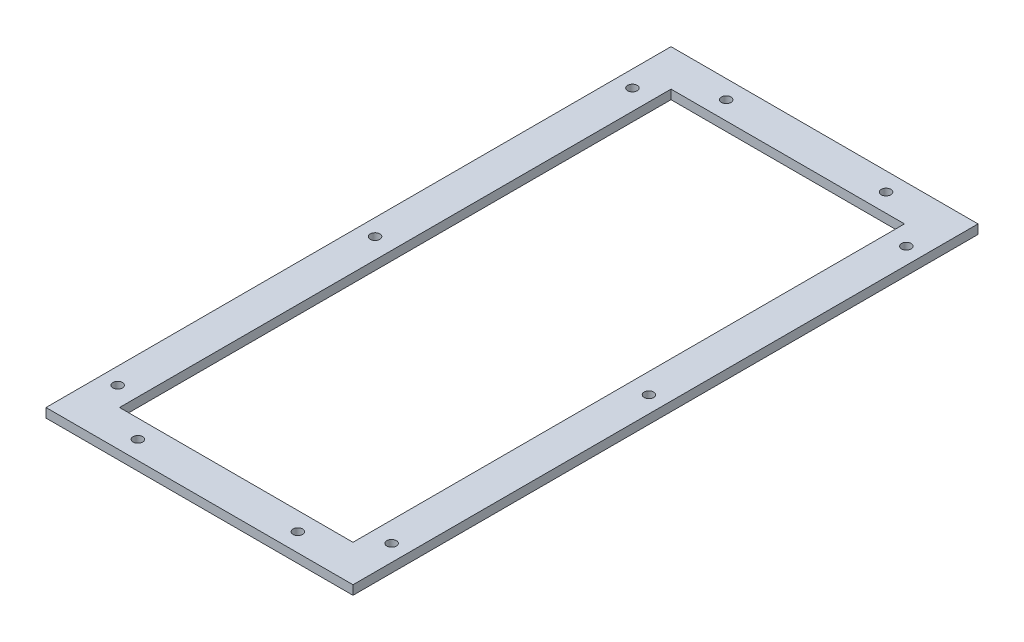
ISO-10303-21;
HEADER;
FILE_DESCRIPTION(('STEP AP214'),'2;1');
FILE_NAME('part.step','',(''),(''),'','','');
FILE_SCHEMA(('AUTOMOTIVE_DESIGN { 1 0 10303 214 1 1 1 1 }'));
ENDSEC;
DATA;
#1=APPLICATION_CONTEXT('core data for automotive mechanical design processes');
#2=APPLICATION_PROTOCOL_DEFINITION('international standard','automotive_design',2000,#1);
#3=PRODUCT_CONTEXT('',#1,'mechanical');
#4=PRODUCT('Part','Part','',(#3));
#5=PRODUCT_RELATED_PRODUCT_CATEGORY('part','',(#4));
#6=PRODUCT_DEFINITION_FORMATION('','',#4);
#7=PRODUCT_DEFINITION_CONTEXT('part definition',#1,'design');
#8=PRODUCT_DEFINITION('design','',#6,#7);
#9=PRODUCT_DEFINITION_SHAPE('','',#8);
#10=(LENGTH_UNIT() NAMED_UNIT(*) SI_UNIT(.MILLI.,.METRE.));
#11=(NAMED_UNIT(*) PLANE_ANGLE_UNIT() SI_UNIT($,.RADIAN.));
#12=(NAMED_UNIT(*) SI_UNIT($,.STERADIAN.) SOLID_ANGLE_UNIT());
#13=UNCERTAINTY_MEASURE_WITH_UNIT(LENGTH_MEASURE(1.E-05),#10,'distance_accuracy_value','');
#14=(GEOMETRIC_REPRESENTATION_CONTEXT(3) GLOBAL_UNCERTAINTY_ASSIGNED_CONTEXT((#13)) GLOBAL_UNIT_ASSIGNED_CONTEXT((#10,
#11,#12)) REPRESENTATION_CONTEXT('',''));
#15=CARTESIAN_POINT('',(0.,0.,0.));
#16=DIRECTION('',(0.,0.,1.));
#17=DIRECTION('',(1.,0.,0.));
#18=AXIS2_PLACEMENT_3D('',#15,#16,#17);
#19=CARTESIAN_POINT('',(0.,5.,0.));
#20=DIRECTION('',(0.,1.,0.));
#21=DIRECTION('',(0.,0.,1.));
#22=AXIS2_PLACEMENT_3D('',#19,#20,#21);
#23=PLANE('',#22);
#24=DIRECTION('',(-1.,0.,0.));
#25=VECTOR('',#24,1.);
#26=CARTESIAN_POINT('',(63.5,5.,-150.));
#27=LINE('',#26,#25);
#28=CARTESIAN_POINT('',(63.5,5.,-150.));
#29=VERTEX_POINT('',#28);
#30=CARTESIAN_POINT('',(-63.5,5.,-150.));
#31=VERTEX_POINT('',#30);
#32=EDGE_CURVE('E52',#29,#31,#27,.T.);
#33=ORIENTED_EDGE('',*,*,#32,.F.);
#34=DIRECTION('',(0.,0.,-1.));
#35=VECTOR('',#34,1.);
#36=CARTESIAN_POINT('',(63.5,5.,150.));
#37=LINE('',#36,#35);
#38=CARTESIAN_POINT('',(63.5,5.,150.));
#39=VERTEX_POINT('',#38);
#40=EDGE_CURVE('E120',#39,#29,#37,.T.);
#41=ORIENTED_EDGE('',*,*,#40,.F.);
#42=DIRECTION('',(1.,0.,0.));
#43=VECTOR('',#42,1.);
#44=CARTESIAN_POINT('',(-63.5,5.,150.));
#45=LINE('',#44,#43);
#46=CARTESIAN_POINT('',(-63.5,5.,150.));
#47=VERTEX_POINT('',#46);
#48=EDGE_CURVE('E105',#47,#39,#45,.T.);
#49=ORIENTED_EDGE('',*,*,#48,.F.);
#50=DIRECTION('',(0.,0.,1.));
#51=VECTOR('',#50,1.);
#52=CARTESIAN_POINT('',(-63.5,5.,-150.));
#53=LINE('',#52,#51);
#54=EDGE_CURVE('E114',#31,#47,#53,.T.);
#55=ORIENTED_EDGE('',*,*,#54,.F.);
#56=EDGE_LOOP('',(#33,#41,#49,#55));
#57=FACE_BOUND('',#56,.T.);
#58=CARTESIAN_POINT('',(-43.5,5.,160.));
#59=DIRECTION('',(0.,1.,0.));
#60=DIRECTION('',(0.,0.,1.));
#61=AXIS2_PLACEMENT_3D('',#58,#59,#60);
#62=CIRCLE('',#61,2.59999999999998);
#63=CARTESIAN_POINT('',(-43.5,5.,162.6));
#64=VERTEX_POINT('',#63);
#65=EDGE_CURVE('E136',#64,#64,#62,.T.);
#66=ORIENTED_EDGE('',*,*,#65,.F.);
#67=EDGE_LOOP('',(#66));
#68=FACE_BOUND('',#67,.T.);
#69=CARTESIAN_POINT('',(-43.5,5.,-160.));
#70=DIRECTION('',(0.,1.,0.));
#71=DIRECTION('',(0.,0.,1.));
#72=AXIS2_PLACEMENT_3D('',#69,#70,#71);
#73=CIRCLE('',#72,2.59999999999997);
#74=CARTESIAN_POINT('',(-43.5,5.,-157.4));
#75=VERTEX_POINT('',#74);
#76=EDGE_CURVE('E148',#75,#75,#73,.T.);
#77=ORIENTED_EDGE('',*,*,#76,.F.);
#78=EDGE_LOOP('',(#77));
#79=FACE_BOUND('',#78,.T.);
#80=CARTESIAN_POINT('',(74.5000000000001,5.,0.));
#81=DIRECTION('',(0.,1.,0.));
#82=DIRECTION('',(0.,0.,1.));
#83=AXIS2_PLACEMENT_3D('',#80,#81,#82);
#84=CIRCLE('',#83,2.6);
#85=CARTESIAN_POINT('',(74.5000000000001,5.,2.6));
#86=VERTEX_POINT('',#85);
#87=EDGE_CURVE('E160',#86,#86,#84,.T.);
#88=ORIENTED_EDGE('',*,*,#87,.F.);
#89=EDGE_LOOP('',(#88));
#90=FACE_BOUND('',#89,.T.);
#91=CARTESIAN_POINT('',(-74.5,5.,140.));
#92=DIRECTION('',(0.,1.,0.));
#93=DIRECTION('',(0.,0.,1.));
#94=AXIS2_PLACEMENT_3D('',#91,#92,#93);
#95=CIRCLE('',#94,2.6);
#96=CARTESIAN_POINT('',(-74.5,5.,142.6));
#97=VERTEX_POINT('',#96);
#98=EDGE_CURVE('E172',#97,#97,#95,.T.);
#99=ORIENTED_EDGE('',*,*,#98,.F.);
#100=EDGE_LOOP('',(#99));
#101=FACE_BOUND('',#100,.T.);
#102=CARTESIAN_POINT('',(-74.5000000000001,5.,-140.));
#103=DIRECTION('',(0.,1.,0.));
#104=DIRECTION('',(0.,0.,1.));
#105=AXIS2_PLACEMENT_3D('',#102,#103,#104);
#106=CIRCLE('',#105,2.6);
#107=CARTESIAN_POINT('',(-74.5000000000001,5.,-137.4));
#108=VERTEX_POINT('',#107);
#109=EDGE_CURVE('E184',#108,#108,#106,.T.);
#110=ORIENTED_EDGE('',*,*,#109,.F.);
#111=EDGE_LOOP('',(#110));
#112=FACE_BOUND('',#111,.T.);
#113=DIRECTION('',(0.,0.,1.));
#114=VECTOR('',#113,1.);
#115=CARTESIAN_POINT('',(-83.5,5.,-170.));
#116=LINE('',#115,#114);
#117=CARTESIAN_POINT('',(-83.5,5.,-170.));
#118=VERTEX_POINT('',#117);
#119=CARTESIAN_POINT('',(-83.5,5.,170.));
#120=VERTEX_POINT('',#119);
#121=EDGE_CURVE('E190',#118,#120,#116,.T.);
#122=ORIENTED_EDGE('',*,*,#121,.T.);
#123=DIRECTION('',(1.,0.,0.));
#124=VECTOR('',#123,1.);
#125=CARTESIAN_POINT('',(-83.5,5.,170.));
#126=LINE('',#125,#124);
#127=CARTESIAN_POINT('',(83.5,5.,170.));
#128=VERTEX_POINT('',#127);
#129=EDGE_CURVE('E193',#120,#128,#126,.T.);
#130=ORIENTED_EDGE('',*,*,#129,.T.);
#131=DIRECTION('',(0.,0.,-1.));
#132=VECTOR('',#131,1.);
#133=CARTESIAN_POINT('',(83.5,5.,-170.));
#134=LINE('',#133,#132);
#135=CARTESIAN_POINT('',(83.5,5.,-170.));
#136=VERTEX_POINT('',#135);
#137=EDGE_CURVE('E196',#128,#136,#134,.T.);
#138=ORIENTED_EDGE('',*,*,#137,.T.);
#139=DIRECTION('',(-1.,0.,0.));
#140=VECTOR('',#139,1.);
#141=CARTESIAN_POINT('',(-83.5,5.,-170.));
#142=LINE('',#141,#140);
#143=EDGE_CURVE('E198',#136,#118,#142,.T.);
#144=ORIENTED_EDGE('',*,*,#143,.T.);
#145=EDGE_LOOP('',(#122,#130,#138,#144));
#146=FACE_BOUND('',#145,.T.);
#147=CARTESIAN_POINT('',(-74.5,5.,0.));
#148=DIRECTION('',(0.,1.,0.));
#149=DIRECTION('',(0.,0.,1.));
#150=AXIS2_PLACEMENT_3D('',#147,#148,#149);
#151=CIRCLE('',#150,2.6);
#152=CARTESIAN_POINT('',(-74.5,5.,2.6));
#153=VERTEX_POINT('',#152);
#154=EDGE_CURVE('E178',#153,#153,#151,.T.);
#155=ORIENTED_EDGE('',*,*,#154,.F.);
#156=EDGE_LOOP('',(#155));
#157=FACE_BOUND('',#156,.T.);
#158=CARTESIAN_POINT('',(74.5000000000001,5.,-140.));
#159=DIRECTION('',(0.,1.,0.));
#160=DIRECTION('',(0.,0.,1.));
#161=AXIS2_PLACEMENT_3D('',#158,#159,#160);
#162=CIRCLE('',#161,2.6);
#163=CARTESIAN_POINT('',(74.5000000000001,5.,-137.4));
#164=VERTEX_POINT('',#163);
#165=EDGE_CURVE('E166',#164,#164,#162,.T.);
#166=ORIENTED_EDGE('',*,*,#165,.F.);
#167=EDGE_LOOP('',(#166));
#168=FACE_BOUND('',#167,.T.);
#169=CARTESIAN_POINT('',(74.5000000000001,5.,140.));
#170=DIRECTION('',(0.,1.,0.));
#171=DIRECTION('',(0.,0.,1.));
#172=AXIS2_PLACEMENT_3D('',#169,#170,#171);
#173=CIRCLE('',#172,2.6);
#174=CARTESIAN_POINT('',(74.5000000000001,5.,142.6));
#175=VERTEX_POINT('',#174);
#176=EDGE_CURVE('E154',#175,#175,#173,.T.);
#177=ORIENTED_EDGE('',*,*,#176,.F.);
#178=EDGE_LOOP('',(#177));
#179=FACE_BOUND('',#178,.T.);
#180=CARTESIAN_POINT('',(43.5000000000001,5.,-160.));
#181=DIRECTION('',(0.,1.,0.));
#182=DIRECTION('',(0.,0.,1.));
#183=AXIS2_PLACEMENT_3D('',#180,#181,#182);
#184=CIRCLE('',#183,2.59999999999997);
#185=CARTESIAN_POINT('',(43.5000000000001,5.,-157.4));
#186=VERTEX_POINT('',#185);
#187=EDGE_CURVE('E142',#186,#186,#184,.T.);
#188=ORIENTED_EDGE('',*,*,#187,.F.);
#189=EDGE_LOOP('',(#188));
#190=FACE_BOUND('',#189,.T.);
#191=CARTESIAN_POINT('',(43.5000000000001,5.,160.));
#192=DIRECTION('',(0.,1.,0.));
#193=DIRECTION('',(0.,0.,1.));
#194=AXIS2_PLACEMENT_3D('',#191,#192,#193);
#195=CIRCLE('',#194,2.59999999999997);
#196=CARTESIAN_POINT('',(43.5000000000001,5.,162.6));
#197=VERTEX_POINT('',#196);
#198=EDGE_CURVE('E130',#197,#197,#195,.T.);
#199=ORIENTED_EDGE('',*,*,#198,.F.);
#200=EDGE_LOOP('',(#199));
#201=FACE_BOUND('',#200,.T.);
#202=ADVANCED_FACE('F37',(#57,#68,#79,#90,#101,#112,#146,#157,#168,#179,#190,#201),#23,.T.);
#203=CARTESIAN_POINT('',(0.,0.,0.));
#204=DIRECTION('',(0.,1.,0.));
#205=DIRECTION('',(0.,0.,1.));
#206=AXIS2_PLACEMENT_3D('',#203,#204,#205);
#207=PLANE('',#206);
#208=DIRECTION('',(0.,0.,-1.));
#209=VECTOR('',#208,1.);
#210=CARTESIAN_POINT('',(63.5,0.,0.));
#211=LINE('',#210,#209);
#212=CARTESIAN_POINT('',(63.5,0.,150.));
#213=VERTEX_POINT('',#212);
#214=CARTESIAN_POINT('',(63.5,0.,-150.));
#215=VERTEX_POINT('',#214);
#216=EDGE_CURVE('E45',#213,#215,#211,.T.);
#217=ORIENTED_EDGE('',*,*,#216,.T.);
#218=DIRECTION('',(-1.,0.,0.));
#219=VECTOR('',#218,1.);
#220=CARTESIAN_POINT('',(0.,0.,-150.));
#221=LINE('',#220,#219);
#222=CARTESIAN_POINT('',(-63.5,0.,-150.));
#223=VERTEX_POINT('',#222);
#224=EDGE_CURVE('E11',#215,#223,#221,.T.);
#225=ORIENTED_EDGE('',*,*,#224,.T.);
#226=DIRECTION('',(0.,0.,1.));
#227=VECTOR('',#226,1.);
#228=CARTESIAN_POINT('',(-63.5,0.,0.));
#229=LINE('',#228,#227);
#230=CARTESIAN_POINT('',(-63.5,0.,150.));
#231=VERTEX_POINT('',#230);
#232=EDGE_CURVE('E219',#223,#231,#229,.T.);
#233=ORIENTED_EDGE('',*,*,#232,.T.);
#234=DIRECTION('',(1.,0.,0.));
#235=VECTOR('',#234,1.);
#236=CARTESIAN_POINT('',(0.,0.,150.));
#237=LINE('',#236,#235);
#238=EDGE_CURVE('E108',#231,#213,#237,.T.);
#239=ORIENTED_EDGE('',*,*,#238,.T.);
#240=EDGE_LOOP('',(#217,#225,#233,#239));
#241=FACE_BOUND('',#240,.T.);
#242=DIRECTION('',(0.,0.,1.));
#243=VECTOR('',#242,1.);
#244=CARTESIAN_POINT('',(-83.5,0.,-170.));
#245=LINE('',#244,#243);
#246=CARTESIAN_POINT('',(-83.5,0.,-170.));
#247=VERTEX_POINT('',#246);
#248=CARTESIAN_POINT('',(-83.5,0.,170.));
#249=VERTEX_POINT('',#248);
#250=EDGE_CURVE('E187',#247,#249,#245,.T.);
#251=ORIENTED_EDGE('',*,*,#250,.F.);
#252=DIRECTION('',(-1.,0.,0.));
#253=VECTOR('',#252,1.);
#254=CARTESIAN_POINT('',(-83.5,0.,-170.));
#255=LINE('',#254,#253);
#256=CARTESIAN_POINT('',(83.5,0.,-170.));
#257=VERTEX_POINT('',#256);
#258=EDGE_CURVE('E194',#257,#247,#255,.T.);
#259=ORIENTED_EDGE('',*,*,#258,.F.);
#260=DIRECTION('',(0.,0.,-1.));
#261=VECTOR('',#260,1.);
#262=CARTESIAN_POINT('',(83.5,0.,-170.));
#263=LINE('',#262,#261);
#264=CARTESIAN_POINT('',(83.5,0.,170.));
#265=VERTEX_POINT('',#264);
#266=EDGE_CURVE('E205',#265,#257,#263,.T.);
#267=ORIENTED_EDGE('',*,*,#266,.F.);
#268=DIRECTION('',(1.,0.,0.));
#269=VECTOR('',#268,1.);
#270=CARTESIAN_POINT('',(-83.5,0.,170.));
#271=LINE('',#270,#269);
#272=EDGE_CURVE('E203',#249,#265,#271,.T.);
#273=ORIENTED_EDGE('',*,*,#272,.F.);
#274=EDGE_LOOP('',(#251,#259,#267,#273));
#275=FACE_BOUND('',#274,.T.);
#276=CARTESIAN_POINT('',(-74.5000000000001,0.,-140.));
#277=DIRECTION('',(0.,1.,0.));
#278=DIRECTION('',(0.,0.,1.));
#279=AXIS2_PLACEMENT_3D('',#276,#277,#278);
#280=CIRCLE('',#279,2.6);
#281=CARTESIAN_POINT('',(-74.5000000000001,0.,-137.4));
#282=VERTEX_POINT('',#281);
#283=EDGE_CURVE('E181',#282,#282,#280,.T.);
#284=ORIENTED_EDGE('',*,*,#283,.T.);
#285=EDGE_LOOP('',(#284));
#286=FACE_BOUND('',#285,.T.);
#287=CARTESIAN_POINT('',(-74.5,0.,0.));
#288=DIRECTION('',(0.,1.,0.));
#289=DIRECTION('',(0.,0.,1.));
#290=AXIS2_PLACEMENT_3D('',#287,#288,#289);
#291=CIRCLE('',#290,2.6);
#292=CARTESIAN_POINT('',(-74.5,0.,2.6));
#293=VERTEX_POINT('',#292);
#294=EDGE_CURVE('E175',#293,#293,#291,.T.);
#295=ORIENTED_EDGE('',*,*,#294,.T.);
#296=EDGE_LOOP('',(#295));
#297=FACE_BOUND('',#296,.T.);
#298=CARTESIAN_POINT('',(-74.5,0.,140.));
#299=DIRECTION('',(0.,1.,0.));
#300=DIRECTION('',(0.,0.,1.));
#301=AXIS2_PLACEMENT_3D('',#298,#299,#300);
#302=CIRCLE('',#301,2.6);
#303=CARTESIAN_POINT('',(-74.5,0.,142.6));
#304=VERTEX_POINT('',#303);
#305=EDGE_CURVE('E169',#304,#304,#302,.T.);
#306=ORIENTED_EDGE('',*,*,#305,.T.);
#307=EDGE_LOOP('',(#306));
#308=FACE_BOUND('',#307,.T.);
#309=CARTESIAN_POINT('',(74.5000000000001,0.,-140.));
#310=DIRECTION('',(0.,1.,0.));
#311=DIRECTION('',(0.,0.,1.));
#312=AXIS2_PLACEMENT_3D('',#309,#310,#311);
#313=CIRCLE('',#312,2.6);
#314=CARTESIAN_POINT('',(74.5000000000001,0.,-137.4));
#315=VERTEX_POINT('',#314);
#316=EDGE_CURVE('E163',#315,#315,#313,.T.);
#317=ORIENTED_EDGE('',*,*,#316,.T.);
#318=EDGE_LOOP('',(#317));
#319=FACE_BOUND('',#318,.T.);
#320=CARTESIAN_POINT('',(74.5000000000001,0.,0.));
#321=DIRECTION('',(0.,1.,0.));
#322=DIRECTION('',(0.,0.,1.));
#323=AXIS2_PLACEMENT_3D('',#320,#321,#322);
#324=CIRCLE('',#323,2.6);
#325=CARTESIAN_POINT('',(74.5000000000001,0.,2.6));
#326=VERTEX_POINT('',#325);
#327=EDGE_CURVE('E157',#326,#326,#324,.T.);
#328=ORIENTED_EDGE('',*,*,#327,.T.);
#329=EDGE_LOOP('',(#328));
#330=FACE_BOUND('',#329,.T.);
#331=CARTESIAN_POINT('',(74.5000000000001,0.,140.));
#332=DIRECTION('',(0.,1.,0.));
#333=DIRECTION('',(0.,0.,1.));
#334=AXIS2_PLACEMENT_3D('',#331,#332,#333);
#335=CIRCLE('',#334,2.6);
#336=CARTESIAN_POINT('',(74.5000000000001,0.,142.6));
#337=VERTEX_POINT('',#336);
#338=EDGE_CURVE('E151',#337,#337,#335,.T.);
#339=ORIENTED_EDGE('',*,*,#338,.T.);
#340=EDGE_LOOP('',(#339));
#341=FACE_BOUND('',#340,.T.);
#342=CARTESIAN_POINT('',(-43.5,0.,-160.));
#343=DIRECTION('',(0.,1.,0.));
#344=DIRECTION('',(0.,0.,1.));
#345=AXIS2_PLACEMENT_3D('',#342,#343,#344);
#346=CIRCLE('',#345,2.59999999999997);
#347=CARTESIAN_POINT('',(-43.5,0.,-157.4));
#348=VERTEX_POINT('',#347);
#349=EDGE_CURVE('E145',#348,#348,#346,.T.);
#350=ORIENTED_EDGE('',*,*,#349,.T.);
#351=EDGE_LOOP('',(#350));
#352=FACE_BOUND('',#351,.T.);
#353=CARTESIAN_POINT('',(43.5000000000001,0.,-160.));
#354=DIRECTION('',(0.,1.,0.));
#355=DIRECTION('',(0.,0.,1.));
#356=AXIS2_PLACEMENT_3D('',#353,#354,#355);
#357=CIRCLE('',#356,2.59999999999997);
#358=CARTESIAN_POINT('',(43.5000000000001,0.,-157.4));
#359=VERTEX_POINT('',#358);
#360=EDGE_CURVE('E139',#359,#359,#357,.T.);
#361=ORIENTED_EDGE('',*,*,#360,.T.);
#362=EDGE_LOOP('',(#361));
#363=FACE_BOUND('',#362,.T.);
#364=CARTESIAN_POINT('',(-43.5,0.,160.));
#365=DIRECTION('',(0.,1.,0.));
#366=DIRECTION('',(0.,0.,1.));
#367=AXIS2_PLACEMENT_3D('',#364,#365,#366);
#368=CIRCLE('',#367,2.59999999999998);
#369=CARTESIAN_POINT('',(-43.5,0.,162.6));
#370=VERTEX_POINT('',#369);
#371=EDGE_CURVE('E133',#370,#370,#368,.T.);
#372=ORIENTED_EDGE('',*,*,#371,.T.);
#373=EDGE_LOOP('',(#372));
#374=FACE_BOUND('',#373,.T.);
#375=CARTESIAN_POINT('',(43.5000000000001,0.,160.));
#376=DIRECTION('',(0.,1.,0.));
#377=DIRECTION('',(0.,0.,1.));
#378=AXIS2_PLACEMENT_3D('',#375,#376,#377);
#379=CIRCLE('',#378,2.59999999999997);
#380=CARTESIAN_POINT('',(43.5000000000001,0.,162.6));
#381=VERTEX_POINT('',#380);
#382=EDGE_CURVE('E127',#381,#381,#379,.T.);
#383=ORIENTED_EDGE('',*,*,#382,.T.);
#384=EDGE_LOOP('',(#383));
#385=FACE_BOUND('',#384,.T.);
#386=ADVANCED_FACE('F223',(#241,#275,#286,#297,#308,#319,#330,#341,#352,#363,#374,#385),#207,.F.);
#387=CARTESIAN_POINT('',(-83.5,5.,-170.));
#388=DIRECTION('',(1.,0.,0.));
#389=DIRECTION('',(0.,0.,-1.));
#390=AXIS2_PLACEMENT_3D('',#387,#388,#389);
#391=PLANE('',#390);
#392=ORIENTED_EDGE('',*,*,#250,.T.);
#393=DIRECTION('',(0.,-1.,0.));
#394=VECTOR('',#393,1.);
#395=CARTESIAN_POINT('',(-83.5,5.,170.));
#396=LINE('',#395,#394);
#397=EDGE_CURVE('E216',#120,#249,#396,.T.);
#398=ORIENTED_EDGE('',*,*,#397,.F.);
#399=ORIENTED_EDGE('',*,*,#121,.F.);
#400=DIRECTION('',(0.,-1.,0.));
#401=VECTOR('',#400,1.);
#402=CARTESIAN_POINT('',(-83.5,5.,-170.));
#403=LINE('',#402,#401);
#404=EDGE_CURVE('E200',#118,#247,#403,.T.);
#405=ORIENTED_EDGE('',*,*,#404,.T.);
#406=EDGE_LOOP('',(#392,#398,#399,#405));
#407=FACE_BOUND('',#406,.T.);
#408=ADVANCED_FACE('F39',(#407),#391,.F.);
#409=CARTESIAN_POINT('',(-83.5,5.,170.));
#410=DIRECTION('',(0.,0.,-1.));
#411=DIRECTION('',(-1.,0.,0.));
#412=AXIS2_PLACEMENT_3D('',#409,#410,#411);
#413=PLANE('',#412);
#414=ORIENTED_EDGE('',*,*,#272,.T.);
#415=DIRECTION('',(0.,-1.,0.));
#416=VECTOR('',#415,1.);
#417=CARTESIAN_POINT('',(83.5,5.,170.));
#418=LINE('',#417,#416);
#419=EDGE_CURVE('E213',#128,#265,#418,.T.);
#420=ORIENTED_EDGE('',*,*,#419,.F.);
#421=ORIENTED_EDGE('',*,*,#129,.F.);
#422=ORIENTED_EDGE('',*,*,#397,.T.);
#423=EDGE_LOOP('',(#414,#420,#421,#422));
#424=FACE_BOUND('',#423,.T.);
#425=ADVANCED_FACE('F257',(#424),#413,.F.);
#426=CARTESIAN_POINT('',(83.5,5.,-170.));
#427=DIRECTION('',(-1.,0.,0.));
#428=DIRECTION('',(0.,0.,1.));
#429=AXIS2_PLACEMENT_3D('',#426,#427,#428);
#430=PLANE('',#429);
#431=ORIENTED_EDGE('',*,*,#266,.T.);
#432=DIRECTION('',(0.,-1.,0.));
#433=VECTOR('',#432,1.);
#434=CARTESIAN_POINT('',(83.5,5.,-170.));
#435=LINE('',#434,#433);
#436=EDGE_CURVE('E210',#136,#257,#435,.T.);
#437=ORIENTED_EDGE('',*,*,#436,.F.);
#438=ORIENTED_EDGE('',*,*,#137,.F.);
#439=ORIENTED_EDGE('',*,*,#419,.T.);
#440=EDGE_LOOP('',(#431,#437,#438,#439));
#441=FACE_BOUND('',#440,.T.);
#442=ADVANCED_FACE('F254',(#441),#430,.F.);
#443=CARTESIAN_POINT('',(-83.5,5.,-170.));
#444=DIRECTION('',(0.,0.,1.));
#445=DIRECTION('',(1.,0.,0.));
#446=AXIS2_PLACEMENT_3D('',#443,#444,#445);
#447=PLANE('',#446);
#448=ORIENTED_EDGE('',*,*,#258,.T.);
#449=ORIENTED_EDGE('',*,*,#404,.F.);
#450=ORIENTED_EDGE('',*,*,#143,.F.);
#451=ORIENTED_EDGE('',*,*,#436,.T.);
#452=EDGE_LOOP('',(#448,#449,#450,#451));
#453=FACE_BOUND('',#452,.T.);
#454=ADVANCED_FACE('F251',(#453),#447,.F.);
#455=CARTESIAN_POINT('',(-74.5000000000001,5.,-140.));
#456=DIRECTION('',(0.,-1.,0.));
#457=DIRECTION('',(0.,0.,-1.));
#458=AXIS2_PLACEMENT_3D('',#455,#456,#457);
#459=CYLINDRICAL_SURFACE('',#458,2.6);
#460=ORIENTED_EDGE('',*,*,#109,.T.);
#461=EDGE_LOOP('',(#460));
#462=FACE_BOUND('',#461,.T.);
#463=ORIENTED_EDGE('',*,*,#283,.F.);
#464=EDGE_LOOP('',(#463));
#465=FACE_BOUND('',#464,.T.);
#466=ADVANCED_FACE('F248',(#462,#465),#459,.F.);
#467=CARTESIAN_POINT('',(-74.5,5.,0.));
#468=DIRECTION('',(0.,-1.,0.));
#469=DIRECTION('',(0.,0.,-1.));
#470=AXIS2_PLACEMENT_3D('',#467,#468,#469);
#471=CYLINDRICAL_SURFACE('',#470,2.6);
#472=ORIENTED_EDGE('',*,*,#154,.T.);
#473=EDGE_LOOP('',(#472));
#474=FACE_BOUND('',#473,.T.);
#475=ORIENTED_EDGE('',*,*,#294,.F.);
#476=EDGE_LOOP('',(#475));
#477=FACE_BOUND('',#476,.T.);
#478=ADVANCED_FACE('F324',(#474,#477),#471,.F.);
#479=CARTESIAN_POINT('',(-74.5,5.,140.));
#480=DIRECTION('',(0.,-1.,0.));
#481=DIRECTION('',(0.,0.,-1.));
#482=AXIS2_PLACEMENT_3D('',#479,#480,#481);
#483=CYLINDRICAL_SURFACE('',#482,2.6);
#484=ORIENTED_EDGE('',*,*,#98,.T.);
#485=EDGE_LOOP('',(#484));
#486=FACE_BOUND('',#485,.T.);
#487=ORIENTED_EDGE('',*,*,#305,.F.);
#488=EDGE_LOOP('',(#487));
#489=FACE_BOUND('',#488,.T.);
#490=ADVANCED_FACE('F321',(#486,#489),#483,.F.);
#491=CARTESIAN_POINT('',(74.5000000000001,5.,-140.));
#492=DIRECTION('',(0.,-1.,0.));
#493=DIRECTION('',(0.,0.,-1.));
#494=AXIS2_PLACEMENT_3D('',#491,#492,#493);
#495=CYLINDRICAL_SURFACE('',#494,2.6);
#496=ORIENTED_EDGE('',*,*,#165,.T.);
#497=EDGE_LOOP('',(#496));
#498=FACE_BOUND('',#497,.T.);
#499=ORIENTED_EDGE('',*,*,#316,.F.);
#500=EDGE_LOOP('',(#499));
#501=FACE_BOUND('',#500,.T.);
#502=ADVANCED_FACE('F317',(#498,#501),#495,.F.);
#503=CARTESIAN_POINT('',(74.5000000000001,5.,0.));
#504=DIRECTION('',(0.,-1.,0.));
#505=DIRECTION('',(0.,0.,-1.));
#506=AXIS2_PLACEMENT_3D('',#503,#504,#505);
#507=CYLINDRICAL_SURFACE('',#506,2.6);
#508=ORIENTED_EDGE('',*,*,#87,.T.);
#509=EDGE_LOOP('',(#508));
#510=FACE_BOUND('',#509,.T.);
#511=ORIENTED_EDGE('',*,*,#327,.F.);
#512=EDGE_LOOP('',(#511));
#513=FACE_BOUND('',#512,.T.);
#514=ADVANCED_FACE('F313',(#510,#513),#507,.F.);
#515=CARTESIAN_POINT('',(74.5000000000001,5.,140.));
#516=DIRECTION('',(0.,-1.,0.));
#517=DIRECTION('',(0.,0.,-1.));
#518=AXIS2_PLACEMENT_3D('',#515,#516,#517);
#519=CYLINDRICAL_SURFACE('',#518,2.6);
#520=ORIENTED_EDGE('',*,*,#176,.T.);
#521=EDGE_LOOP('',(#520));
#522=FACE_BOUND('',#521,.T.);
#523=ORIENTED_EDGE('',*,*,#338,.F.);
#524=EDGE_LOOP('',(#523));
#525=FACE_BOUND('',#524,.T.);
#526=ADVANCED_FACE('F309',(#522,#525),#519,.F.);
#527=CARTESIAN_POINT('',(-43.5,5.,-160.));
#528=DIRECTION('',(0.,-1.,0.));
#529=DIRECTION('',(0.,0.,-1.));
#530=AXIS2_PLACEMENT_3D('',#527,#528,#529);
#531=CYLINDRICAL_SURFACE('',#530,2.59999999999997);
#532=ORIENTED_EDGE('',*,*,#76,.T.);
#533=EDGE_LOOP('',(#532));
#534=FACE_BOUND('',#533,.T.);
#535=ORIENTED_EDGE('',*,*,#349,.F.);
#536=EDGE_LOOP('',(#535));
#537=FACE_BOUND('',#536,.T.);
#538=ADVANCED_FACE('F294',(#534,#537),#531,.F.);
#539=CARTESIAN_POINT('',(43.5000000000001,5.,-160.));
#540=DIRECTION('',(0.,-1.,0.));
#541=DIRECTION('',(0.,0.,-1.));
#542=AXIS2_PLACEMENT_3D('',#539,#540,#541);
#543=CYLINDRICAL_SURFACE('',#542,2.59999999999997);
#544=ORIENTED_EDGE('',*,*,#187,.T.);
#545=EDGE_LOOP('',(#544));
#546=FACE_BOUND('',#545,.T.);
#547=ORIENTED_EDGE('',*,*,#360,.F.);
#548=EDGE_LOOP('',(#547));
#549=FACE_BOUND('',#548,.T.);
#550=ADVANCED_FACE('F291',(#546,#549),#543,.F.);
#551=CARTESIAN_POINT('',(-43.5,5.,160.));
#552=DIRECTION('',(0.,-1.,0.));
#553=DIRECTION('',(0.,0.,-1.));
#554=AXIS2_PLACEMENT_3D('',#551,#552,#553);
#555=CYLINDRICAL_SURFACE('',#554,2.59999999999998);
#556=ORIENTED_EDGE('',*,*,#65,.T.);
#557=EDGE_LOOP('',(#556));
#558=FACE_BOUND('',#557,.T.);
#559=ORIENTED_EDGE('',*,*,#371,.F.);
#560=EDGE_LOOP('',(#559));
#561=FACE_BOUND('',#560,.T.);
#562=ADVANCED_FACE('F237',(#558,#561),#555,.F.);
#563=CARTESIAN_POINT('',(43.5000000000001,5.,160.));
#564=DIRECTION('',(0.,-1.,0.));
#565=DIRECTION('',(0.,0.,-1.));
#566=AXIS2_PLACEMENT_3D('',#563,#564,#565);
#567=CYLINDRICAL_SURFACE('',#566,2.59999999999997);
#568=ORIENTED_EDGE('',*,*,#198,.T.);
#569=EDGE_LOOP('',(#568));
#570=FACE_BOUND('',#569,.T.);
#571=ORIENTED_EDGE('',*,*,#382,.F.);
#572=EDGE_LOOP('',(#571));
#573=FACE_BOUND('',#572,.T.);
#574=ADVANCED_FACE('F230',(#570,#573),#567,.F.);
#575=CARTESIAN_POINT('',(63.5,-5.,-150.));
#576=DIRECTION('',(0.,0.,-1.));
#577=DIRECTION('',(-1.,0.,0.));
#578=AXIS2_PLACEMENT_3D('',#575,#576,#577);
#579=PLANE('',#578);
#580=DIRECTION('',(0.,1.,0.));
#581=VECTOR('',#580,1.);
#582=CARTESIAN_POINT('',(63.5,-5.,-150.));
#583=LINE('',#582,#581);
#584=EDGE_CURVE('E125',#215,#29,#583,.T.);
#585=ORIENTED_EDGE('',*,*,#584,.T.);
#586=ORIENTED_EDGE('',*,*,#32,.T.);
#587=DIRECTION('',(0.,1.,0.));
#588=VECTOR('',#587,1.);
#589=CARTESIAN_POINT('',(-63.5,-5.,-150.));
#590=LINE('',#589,#588);
#591=EDGE_CURVE('E111',#223,#31,#590,.T.);
#592=ORIENTED_EDGE('',*,*,#591,.F.);
#593=ORIENTED_EDGE('',*,*,#224,.F.);
#594=EDGE_LOOP('',(#585,#586,#592,#593));
#595=FACE_BOUND('',#594,.T.);
#596=ADVANCED_FACE('F228',(#595),#579,.F.);
#597=CARTESIAN_POINT('',(63.5,-5.,150.));
#598=DIRECTION('',(1.,0.,0.));
#599=DIRECTION('',(0.,0.,-1.));
#600=AXIS2_PLACEMENT_3D('',#597,#598,#599);
#601=PLANE('',#600);
#602=DIRECTION('',(0.,1.,0.));
#603=VECTOR('',#602,1.);
#604=CARTESIAN_POINT('',(63.5,-5.,150.));
#605=LINE('',#604,#603);
#606=EDGE_CURVE('E110',#213,#39,#605,.T.);
#607=ORIENTED_EDGE('',*,*,#606,.T.);
#608=ORIENTED_EDGE('',*,*,#40,.T.);
#609=ORIENTED_EDGE('',*,*,#584,.F.);
#610=ORIENTED_EDGE('',*,*,#216,.F.);
#611=EDGE_LOOP('',(#607,#608,#609,#610));
#612=FACE_BOUND('',#611,.T.);
#613=ADVANCED_FACE('F227',(#612),#601,.F.);
#614=CARTESIAN_POINT('',(-63.5,-5.,150.));
#615=DIRECTION('',(0.,0.,1.));
#616=DIRECTION('',(1.,0.,0.));
#617=AXIS2_PLACEMENT_3D('',#614,#615,#616);
#618=PLANE('',#617);
#619=DIRECTION('',(0.,1.,0.));
#620=VECTOR('',#619,1.);
#621=CARTESIAN_POINT('',(-63.5,-5.,150.));
#622=LINE('',#621,#620);
#623=EDGE_CURVE('E60',#231,#47,#622,.T.);
#624=ORIENTED_EDGE('',*,*,#623,.T.);
#625=ORIENTED_EDGE('',*,*,#48,.T.);
#626=ORIENTED_EDGE('',*,*,#606,.F.);
#627=ORIENTED_EDGE('',*,*,#238,.F.);
#628=EDGE_LOOP('',(#624,#625,#626,#627));
#629=FACE_BOUND('',#628,.T.);
#630=ADVANCED_FACE('F102',(#629),#618,.F.);
#631=CARTESIAN_POINT('',(-63.5,-5.,-150.));
#632=DIRECTION('',(-1.,0.,0.));
#633=DIRECTION('',(0.,0.,1.));
#634=AXIS2_PLACEMENT_3D('',#631,#632,#633);
#635=PLANE('',#634);
#636=ORIENTED_EDGE('',*,*,#591,.T.);
#637=ORIENTED_EDGE('',*,*,#54,.T.);
#638=ORIENTED_EDGE('',*,*,#623,.F.);
#639=ORIENTED_EDGE('',*,*,#232,.F.);
#640=EDGE_LOOP('',(#636,#637,#638,#639));
#641=FACE_BOUND('',#640,.T.);
#642=ADVANCED_FACE('F115',(#641),#635,.F.);
#643=CLOSED_SHELL('',(#202,#386,#408,#425,#442,#454,#466,#478,#490,#502,#514,#526,#538,#550,
#562,#574,#596,#613,#630,#642));
#644=MANIFOLD_SOLID_BREP('B2',#643);
#645=ADVANCED_BREP_SHAPE_REPRESENTATION('',(#18,#644),#14);
#646=SHAPE_DEFINITION_REPRESENTATION(#9,#645);
ENDSEC;
END-ISO-10303-21;
